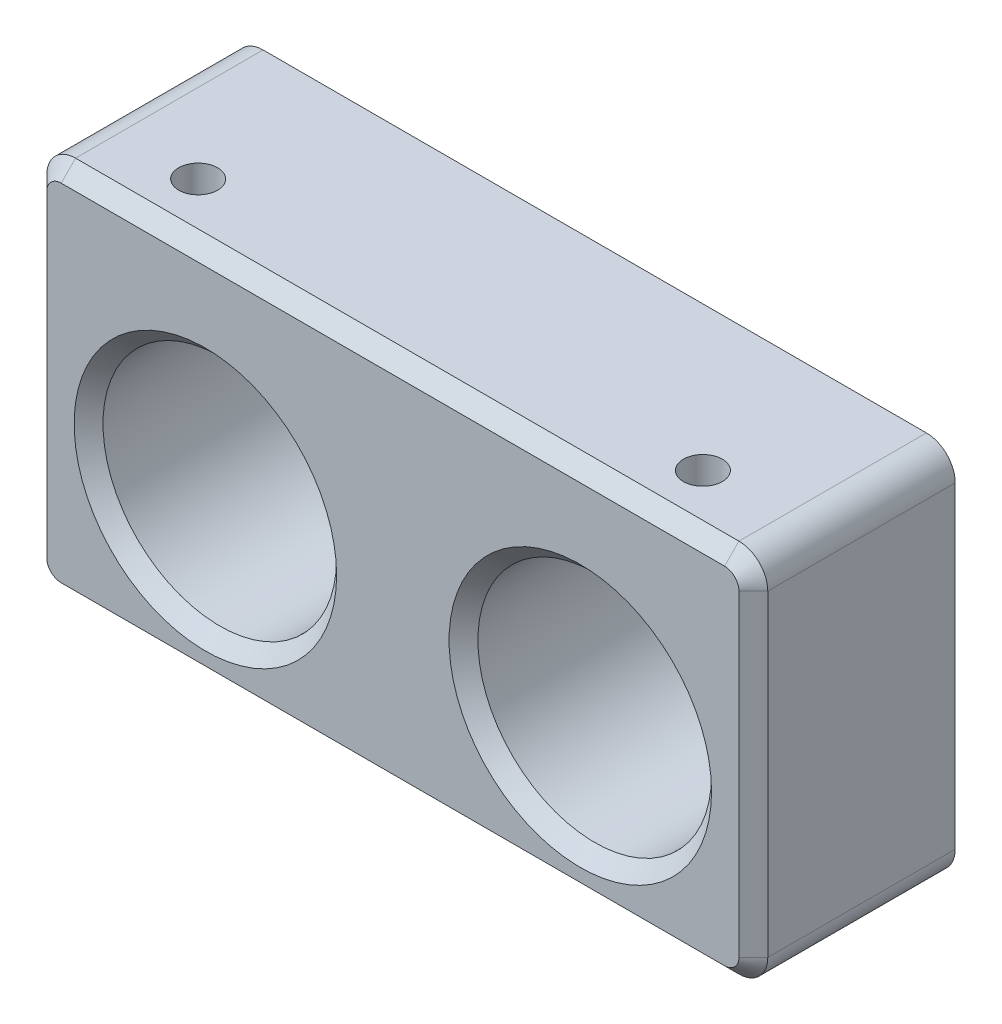
ISO-10303-21;
HEADER;
FILE_DESCRIPTION(('STEP AP214'),'2;1');
FILE_NAME('part.step','',(''),(''),'','','');
FILE_SCHEMA(('AUTOMOTIVE_DESIGN { 1 0 10303 214 1 1 1 1 }'));
ENDSEC;
DATA;
#1=APPLICATION_CONTEXT('core data for automotive mechanical design processes');
#2=APPLICATION_PROTOCOL_DEFINITION('international standard','automotive_design',2000,#1);
#3=PRODUCT_CONTEXT('',#1,'mechanical');
#4=PRODUCT('Part','Part','',(#3));
#5=PRODUCT_RELATED_PRODUCT_CATEGORY('part','',(#4));
#6=PRODUCT_DEFINITION_FORMATION('','',#4);
#7=PRODUCT_DEFINITION_CONTEXT('part definition',#1,'design');
#8=PRODUCT_DEFINITION('design','',#6,#7);
#9=PRODUCT_DEFINITION_SHAPE('','',#8);
#10=(LENGTH_UNIT() NAMED_UNIT(*) SI_UNIT(.MILLI.,.METRE.));
#11=(NAMED_UNIT(*) PLANE_ANGLE_UNIT() SI_UNIT($,.RADIAN.));
#12=(NAMED_UNIT(*) SI_UNIT($,.STERADIAN.) SOLID_ANGLE_UNIT());
#13=UNCERTAINTY_MEASURE_WITH_UNIT(LENGTH_MEASURE(1.E-05),#10,'distance_accuracy_value','');
#14=(GEOMETRIC_REPRESENTATION_CONTEXT(3) GLOBAL_UNCERTAINTY_ASSIGNED_CONTEXT((#13)) GLOBAL_UNIT_ASSIGNED_CONTEXT((#10,
#11,#12)) REPRESENTATION_CONTEXT('',''));
#15=CARTESIAN_POINT('',(0.,0.,0.));
#16=DIRECTION('',(0.,0.,1.));
#17=DIRECTION('',(1.,0.,0.));
#18=AXIS2_PLACEMENT_3D('',#15,#16,#17);
#19=CARTESIAN_POINT('',(0.,0.,14.));
#20=DIRECTION('',(0.,0.,1.));
#21=DIRECTION('',(1.,0.,0.));
#22=AXIS2_PLACEMENT_3D('',#19,#20,#21);
#23=PLANE('',#22);
#24=CARTESIAN_POINT('',(23.,13.,14.));
#25=DIRECTION('',(0.,0.,1.));
#26=DIRECTION('',(1.,0.,0.));
#27=AXIS2_PLACEMENT_3D('',#24,#25,#26);
#28=CIRCLE('',#27,1.);
#29=CARTESIAN_POINT('',(24.,13.,14.));
#30=VERTEX_POINT('',#29);
#31=CARTESIAN_POINT('',(23.,14.,14.));
#32=VERTEX_POINT('',#31);
#33=EDGE_CURVE('E329',#30,#32,#28,.T.);
#34=ORIENTED_EDGE('',*,*,#33,.T.);
#35=DIRECTION('',(-1.,0.,0.));
#36=VECTOR('',#35,1.);
#37=CARTESIAN_POINT('',(-23.,14.,14.));
#38=LINE('',#37,#36);
#39=CARTESIAN_POINT('',(-23.,14.,14.));
#40=VERTEX_POINT('',#39);
#41=EDGE_CURVE('E333',#32,#40,#38,.T.);
#42=ORIENTED_EDGE('',*,*,#41,.T.);
#43=CARTESIAN_POINT('',(-23.,13.,14.));
#44=DIRECTION('',(0.,0.,1.));
#45=DIRECTION('',(1.,0.,0.));
#46=AXIS2_PLACEMENT_3D('',#43,#44,#45);
#47=CIRCLE('',#46,1.);
#48=CARTESIAN_POINT('',(-24.,13.,14.));
#49=VERTEX_POINT('',#48);
#50=EDGE_CURVE('E331',#40,#49,#47,.T.);
#51=ORIENTED_EDGE('',*,*,#50,.T.);
#52=DIRECTION('',(0.,-1.,0.));
#53=VECTOR('',#52,1.);
#54=CARTESIAN_POINT('',(-24.,-8.99999999999999,14.));
#55=LINE('',#54,#53);
#56=CARTESIAN_POINT('',(-24.,-9.,14.));
#57=VERTEX_POINT('',#56);
#58=EDGE_CURVE('E327',#49,#57,#55,.T.);
#59=ORIENTED_EDGE('',*,*,#58,.T.);
#60=CARTESIAN_POINT('',(-23.,-9.,14.));
#61=DIRECTION('',(0.,0.,1.));
#62=DIRECTION('',(1.,0.,0.));
#63=AXIS2_PLACEMENT_3D('',#60,#61,#62);
#64=CIRCLE('',#63,0.999999999999997);
#65=CARTESIAN_POINT('',(-23.,-10.,14.));
#66=VERTEX_POINT('',#65);
#67=EDGE_CURVE('E323',#57,#66,#64,.T.);
#68=ORIENTED_EDGE('',*,*,#67,.T.);
#69=DIRECTION('',(1.,0.,0.));
#70=VECTOR('',#69,1.);
#71=CARTESIAN_POINT('',(23.,-10.,14.));
#72=LINE('',#71,#70);
#73=CARTESIAN_POINT('',(23.,-10.,14.));
#74=VERTEX_POINT('',#73);
#75=EDGE_CURVE('E319',#66,#74,#72,.T.);
#76=ORIENTED_EDGE('',*,*,#75,.T.);
#77=CARTESIAN_POINT('',(23.,-9.,14.));
#78=DIRECTION('',(0.,0.,1.));
#79=DIRECTION('',(1.,0.,0.));
#80=AXIS2_PLACEMENT_3D('',#77,#78,#79);
#81=CIRCLE('',#80,1.);
#82=CARTESIAN_POINT('',(24.,-9.,14.));
#83=VERTEX_POINT('',#82);
#84=EDGE_CURVE('E321',#74,#83,#81,.T.);
#85=ORIENTED_EDGE('',*,*,#84,.T.);
#86=DIRECTION('',(0.,1.,0.));
#87=VECTOR('',#86,1.);
#88=CARTESIAN_POINT('',(24.,13.,14.));
#89=LINE('',#88,#87);
#90=EDGE_CURVE('E325',#83,#30,#89,.T.);
#91=ORIENTED_EDGE('',*,*,#90,.T.);
#92=EDGE_LOOP('',(#34,#42,#51,#59,#68,#76,#85,#91));
#93=FACE_BOUND('',#92,.T.);
#94=CARTESIAN_POINT('',(13.,0.,14.));
#95=DIRECTION('',(0.,0.,1.));
#96=DIRECTION('',(1.,0.,0.));
#97=AXIS2_PLACEMENT_3D('',#94,#95,#96);
#98=CIRCLE('',#97,9.1);
#99=CARTESIAN_POINT('',(22.1,0.,14.));
#100=VERTEX_POINT('',#99);
#101=EDGE_CURVE('E286',#100,#100,#98,.F.);
#102=ORIENTED_EDGE('',*,*,#101,.T.);
#103=EDGE_LOOP('',(#102));
#104=FACE_BOUND('',#103,.T.);
#105=CARTESIAN_POINT('',(-13.,0.,14.));
#106=DIRECTION('',(0.,0.,1.));
#107=DIRECTION('',(1.,0.,0.));
#108=AXIS2_PLACEMENT_3D('',#105,#106,#107);
#109=CIRCLE('',#108,9.10000000000002);
#110=CARTESIAN_POINT('',(-3.89999999999998,0.,14.));
#111=VERTEX_POINT('',#110);
#112=EDGE_CURVE('E283',#111,#111,#109,.F.);
#113=ORIENTED_EDGE('',*,*,#112,.T.);
#114=EDGE_LOOP('',(#113));
#115=FACE_BOUND('',#114,.T.);
#116=ADVANCED_FACE('F35',(#93,#104,#115),#23,.T.);
#117=CARTESIAN_POINT('',(0.,0.,0.));
#118=DIRECTION('',(0.,0.,1.));
#119=DIRECTION('',(1.,0.,0.));
#120=AXIS2_PLACEMENT_3D('',#117,#118,#119);
#121=PLANE('',#120);
#122=DIRECTION('',(-1.,0.,0.));
#123=VECTOR('',#122,1.);
#124=CARTESIAN_POINT('',(6.,7.,0.));
#125=LINE('',#124,#123);
#126=CARTESIAN_POINT('',(6.,7.,0.));
#127=VERTEX_POINT('',#126);
#128=CARTESIAN_POINT('',(-6.,7.,0.));
#129=VERTEX_POINT('',#128);
#130=EDGE_CURVE('E234',#127,#129,#125,.T.);
#131=ORIENTED_EDGE('',*,*,#130,.F.);
#132=DIRECTION('',(0.,-1.,0.));
#133=VECTOR('',#132,1.);
#134=CARTESIAN_POINT('',(6.,11.,0.));
#135=LINE('',#134,#133);
#136=CARTESIAN_POINT('',(6.,11.,0.));
#137=VERTEX_POINT('',#136);
#138=EDGE_CURVE('E232',#137,#127,#135,.T.);
#139=ORIENTED_EDGE('',*,*,#138,.F.);
#140=DIRECTION('',(1.,0.,0.));
#141=VECTOR('',#140,1.);
#142=CARTESIAN_POINT('',(6.,11.,0.));
#143=LINE('',#142,#141);
#144=CARTESIAN_POINT('',(-6.,11.,0.));
#145=VERTEX_POINT('',#144);
#146=EDGE_CURVE('E222',#145,#137,#143,.T.);
#147=ORIENTED_EDGE('',*,*,#146,.F.);
#148=DIRECTION('',(0.,1.,0.));
#149=VECTOR('',#148,1.);
#150=CARTESIAN_POINT('',(-6.,11.,0.));
#151=LINE('',#150,#149);
#152=EDGE_CURVE('E238',#129,#145,#151,.T.);
#153=ORIENTED_EDGE('',*,*,#152,.F.);
#154=EDGE_LOOP('',(#131,#139,#147,#153));
#155=FACE_BOUND('',#154,.T.);
#156=DIRECTION('',(0.,-1.,0.));
#157=VECTOR('',#156,1.);
#158=CARTESIAN_POINT('',(-25.,15.,0.));
#159=LINE('',#158,#157);
#160=CARTESIAN_POINT('',(-25.,13.,0.));
#161=VERTEX_POINT('',#160);
#162=CARTESIAN_POINT('',(-25.,-8.99999999999999,0.));
#163=VERTEX_POINT('',#162);
#164=EDGE_CURVE('E269',#161,#163,#159,.T.);
#165=ORIENTED_EDGE('',*,*,#164,.F.);
#166=CARTESIAN_POINT('',(-23.,13.,0.));
#167=DIRECTION('',(0.,0.,1.));
#168=DIRECTION('',(1.,0.,0.));
#169=AXIS2_PLACEMENT_3D('',#166,#167,#168);
#170=CIRCLE('',#169,2.);
#171=CARTESIAN_POINT('',(-23.,15.,0.));
#172=VERTEX_POINT('',#171);
#173=EDGE_CURVE('E303',#161,#172,#170,.F.);
#174=ORIENTED_EDGE('',*,*,#173,.T.);
#175=DIRECTION('',(-1.,0.,0.));
#176=VECTOR('',#175,1.);
#177=CARTESIAN_POINT('',(-25.,15.,0.));
#178=LINE('',#177,#176);
#179=CARTESIAN_POINT('',(23.,15.,0.));
#180=VERTEX_POINT('',#179);
#181=EDGE_CURVE('E277',#180,#172,#178,.T.);
#182=ORIENTED_EDGE('',*,*,#181,.F.);
#183=CARTESIAN_POINT('',(23.,13.,0.));
#184=DIRECTION('',(0.,0.,1.));
#185=DIRECTION('',(1.,0.,0.));
#186=AXIS2_PLACEMENT_3D('',#183,#184,#185);
#187=CIRCLE('',#186,2.);
#188=CARTESIAN_POINT('',(25.,13.,0.));
#189=VERTEX_POINT('',#188);
#190=EDGE_CURVE('E301',#180,#189,#187,.F.);
#191=ORIENTED_EDGE('',*,*,#190,.T.);
#192=DIRECTION('',(0.,1.,0.));
#193=VECTOR('',#192,1.);
#194=CARTESIAN_POINT('',(25.,15.,0.));
#195=LINE('',#194,#193);
#196=CARTESIAN_POINT('',(25.,-8.99999999999999,0.));
#197=VERTEX_POINT('',#196);
#198=EDGE_CURVE('E274',#197,#189,#195,.T.);
#199=ORIENTED_EDGE('',*,*,#198,.F.);
#200=CARTESIAN_POINT('',(23.,-9.,0.));
#201=DIRECTION('',(0.,0.,1.));
#202=DIRECTION('',(1.,0.,0.));
#203=AXIS2_PLACEMENT_3D('',#200,#201,#202);
#204=CIRCLE('',#203,2.);
#205=CARTESIAN_POINT('',(23.,-11.,0.));
#206=VERTEX_POINT('',#205);
#207=EDGE_CURVE('E299',#197,#206,#204,.F.);
#208=ORIENTED_EDGE('',*,*,#207,.T.);
#209=DIRECTION('',(1.,0.,0.));
#210=VECTOR('',#209,1.);
#211=CARTESIAN_POINT('',(-25.,-11.,0.));
#212=LINE('',#211,#210);
#213=CARTESIAN_POINT('',(6.,-11.,0.));
#214=VERTEX_POINT('',#213);
#215=EDGE_CURVE('E272',#214,#206,#212,.T.);
#216=ORIENTED_EDGE('',*,*,#215,.F.);
#217=DIRECTION('',(0.,-1.,0.));
#218=VECTOR('',#217,1.);
#219=CARTESIAN_POINT('',(6.,-11.,0.));
#220=LINE('',#219,#218);
#221=CARTESIAN_POINT('',(6.,-7.00000000000001,0.));
#222=VERTEX_POINT('',#221);
#223=EDGE_CURVE('E372',#222,#214,#220,.T.);
#224=ORIENTED_EDGE('',*,*,#223,.F.);
#225=CARTESIAN_POINT('',(5.,-7.,0.));
#226=DIRECTION('',(0.,0.,-1.));
#227=DIRECTION('',(1.,0.,0.));
#228=AXIS2_PLACEMENT_3D('',#225,#226,#227);
#229=CIRCLE('',#228,1.);
#230=CARTESIAN_POINT('',(4.99999999999999,-6.,0.));
#231=VERTEX_POINT('',#230);
#232=EDGE_CURVE('E390',#231,#222,#229,.T.);
#233=ORIENTED_EDGE('',*,*,#232,.F.);
#234=DIRECTION('',(1.,0.,0.));
#235=VECTOR('',#234,1.);
#236=CARTESIAN_POINT('',(4.99999999999999,-6.,0.));
#237=LINE('',#236,#235);
#238=CARTESIAN_POINT('',(-4.99999999999999,-6.,0.));
#239=VERTEX_POINT('',#238);
#240=EDGE_CURVE('E387',#239,#231,#237,.T.);
#241=ORIENTED_EDGE('',*,*,#240,.F.);
#242=CARTESIAN_POINT('',(-5.,-7.,0.));
#243=DIRECTION('',(0.,0.,-1.));
#244=DIRECTION('',(1.,0.,0.));
#245=AXIS2_PLACEMENT_3D('',#242,#243,#244);
#246=CIRCLE('',#245,1.);
#247=CARTESIAN_POINT('',(-6.,-7.00000000000001,0.));
#248=VERTEX_POINT('',#247);
#249=EDGE_CURVE('E380',#248,#239,#246,.T.);
#250=ORIENTED_EDGE('',*,*,#249,.F.);
#251=DIRECTION('',(0.,1.,0.));
#252=VECTOR('',#251,1.);
#253=CARTESIAN_POINT('',(-6.,-11.,0.));
#254=LINE('',#253,#252);
#255=CARTESIAN_POINT('',(-6.,-11.,0.));
#256=VERTEX_POINT('',#255);
#257=EDGE_CURVE('E376',#256,#248,#254,.T.);
#258=ORIENTED_EDGE('',*,*,#257,.F.);
#259=CARTESIAN_POINT('',(-23.,-11.,0.));
#260=VERTEX_POINT('',#259);
#261=EDGE_CURVE('E209',#260,#256,#212,.T.);
#262=ORIENTED_EDGE('',*,*,#261,.F.);
#263=CARTESIAN_POINT('',(-23.,-9.,0.));
#264=DIRECTION('',(0.,0.,1.));
#265=DIRECTION('',(1.,0.,0.));
#266=AXIS2_PLACEMENT_3D('',#263,#264,#265);
#267=CIRCLE('',#266,2.);
#268=EDGE_CURVE('E297',#260,#163,#267,.F.);
#269=ORIENTED_EDGE('',*,*,#268,.T.);
#270=EDGE_LOOP('',(#165,#174,#182,#191,#199,#208,#216,#224,#233,#241,#250,#258,#262,#269));
#271=FACE_BOUND('',#270,.T.);
#272=CARTESIAN_POINT('',(-13.,0.,0.));
#273=DIRECTION('',(0.,0.,1.));
#274=DIRECTION('',(1.,0.,0.));
#275=AXIS2_PLACEMENT_3D('',#272,#273,#274);
#276=CIRCLE('',#275,8.1);
#277=CARTESIAN_POINT('',(-4.9,0.,0.));
#278=VERTEX_POINT('',#277);
#279=EDGE_CURVE('E266',#278,#278,#276,.T.);
#280=ORIENTED_EDGE('',*,*,#279,.T.);
#281=EDGE_LOOP('',(#280));
#282=FACE_BOUND('',#281,.T.);
#283=CARTESIAN_POINT('',(13.,0.,0.));
#284=DIRECTION('',(0.,0.,1.));
#285=DIRECTION('',(1.,0.,0.));
#286=AXIS2_PLACEMENT_3D('',#283,#284,#285);
#287=CIRCLE('',#286,8.1);
#288=CARTESIAN_POINT('',(21.1,0.,0.));
#289=VERTEX_POINT('',#288);
#290=EDGE_CURVE('E261',#289,#289,#287,.T.);
#291=ORIENTED_EDGE('',*,*,#290,.T.);
#292=EDGE_LOOP('',(#291));
#293=FACE_BOUND('',#292,.T.);
#294=ADVANCED_FACE('F407',(#155,#271,#282,#293),#121,.F.);
#295=CARTESIAN_POINT('',(-25.,15.,14.));
#296=DIRECTION('',(1.,0.,0.));
#297=DIRECTION('',(0.,1.,0.));
#298=AXIS2_PLACEMENT_3D('',#295,#296,#297);
#299=PLANE('',#298);
#300=DIRECTION('',(0.,0.,-1.));
#301=VECTOR('',#300,1.);
#302=CARTESIAN_POINT('',(-25.,-9.,14.));
#303=LINE('',#302,#301);
#304=CARTESIAN_POINT('',(-25.,-9.,13.));
#305=VERTEX_POINT('',#304);
#306=EDGE_CURVE('E292',#163,#305,#303,.F.);
#307=ORIENTED_EDGE('',*,*,#306,.T.);
#308=DIRECTION('',(0.,1.,0.));
#309=VECTOR('',#308,1.);
#310=CARTESIAN_POINT('',(-25.,13.,13.));
#311=LINE('',#310,#309);
#312=CARTESIAN_POINT('',(-25.,13.,13.));
#313=VERTEX_POINT('',#312);
#314=EDGE_CURVE('E343',#305,#313,#311,.T.);
#315=ORIENTED_EDGE('',*,*,#314,.T.);
#316=DIRECTION('',(0.,0.,-1.));
#317=VECTOR('',#316,1.);
#318=CARTESIAN_POINT('',(-25.,13.,14.));
#319=LINE('',#318,#317);
#320=EDGE_CURVE('E295',#313,#161,#319,.T.);
#321=ORIENTED_EDGE('',*,*,#320,.T.);
#322=ORIENTED_EDGE('',*,*,#164,.T.);
#323=EDGE_LOOP('',(#307,#315,#321,#322));
#324=FACE_BOUND('',#323,.T.);
#325=ADVANCED_FACE('F430',(#324),#299,.F.);
#326=CARTESIAN_POINT('',(-25.,-11.,14.));
#327=DIRECTION('',(0.,1.,0.));
#328=DIRECTION('',(0.,0.,1.));
#329=AXIS2_PLACEMENT_3D('',#326,#327,#328);
#330=PLANE('',#329);
#331=DIRECTION('',(0.,0.,-1.));
#332=VECTOR('',#331,1.);
#333=CARTESIAN_POINT('',(23.,-11.,14.));
#334=LINE('',#333,#332);
#335=CARTESIAN_POINT('',(23.,-11.,13.));
#336=VERTEX_POINT('',#335);
#337=EDGE_CURVE('E317',#206,#336,#334,.F.);
#338=ORIENTED_EDGE('',*,*,#337,.T.);
#339=DIRECTION('',(-1.,0.,0.));
#340=VECTOR('',#339,1.);
#341=CARTESIAN_POINT('',(-23.,-11.,13.));
#342=LINE('',#341,#340);
#343=CARTESIAN_POINT('',(-23.,-11.,13.));
#344=VERTEX_POINT('',#343);
#345=EDGE_CURVE('E11',#336,#344,#342,.T.);
#346=ORIENTED_EDGE('',*,*,#345,.T.);
#347=DIRECTION('',(0.,0.,-1.));
#348=VECTOR('',#347,1.);
#349=CARTESIAN_POINT('',(-23.,-11.,14.));
#350=LINE('',#349,#348);
#351=EDGE_CURVE('E315',#344,#260,#350,.T.);
#352=ORIENTED_EDGE('',*,*,#351,.T.);
#353=ORIENTED_EDGE('',*,*,#261,.T.);
#354=DIRECTION('',(0.,0.,-1.));
#355=VECTOR('',#354,1.);
#356=CARTESIAN_POINT('',(-6.,-11.,4.));
#357=LINE('',#356,#355);
#358=CARTESIAN_POINT('',(-6.,-11.,4.));
#359=VERTEX_POINT('',#358);
#360=EDGE_CURVE('E190',#359,#256,#357,.T.);
#361=ORIENTED_EDGE('',*,*,#360,.F.);
#362=DIRECTION('',(-1.,0.,0.));
#363=VECTOR('',#362,1.);
#364=CARTESIAN_POINT('',(6.,-11.,4.));
#365=LINE('',#364,#363);
#366=CARTESIAN_POINT('',(6.,-11.,4.));
#367=VERTEX_POINT('',#366);
#368=EDGE_CURVE('E197',#367,#359,#365,.T.);
#369=ORIENTED_EDGE('',*,*,#368,.F.);
#370=DIRECTION('',(0.,0.,-1.));
#371=VECTOR('',#370,1.);
#372=CARTESIAN_POINT('',(6.,-11.,4.));
#373=LINE('',#372,#371);
#374=EDGE_CURVE('E210',#367,#214,#373,.T.);
#375=ORIENTED_EDGE('',*,*,#374,.T.);
#376=ORIENTED_EDGE('',*,*,#215,.T.);
#377=EDGE_LOOP('',(#338,#346,#352,#353,#361,#369,#375,#376));
#378=FACE_BOUND('',#377,.T.);
#379=ADVANCED_FACE('F207',(#378),#330,.F.);
#380=CARTESIAN_POINT('',(25.,15.,14.));
#381=DIRECTION('',(-1.,0.,0.));
#382=DIRECTION('',(0.,-1.,0.));
#383=AXIS2_PLACEMENT_3D('',#380,#381,#382);
#384=PLANE('',#383);
#385=DIRECTION('',(0.,0.,-1.));
#386=VECTOR('',#385,1.);
#387=CARTESIAN_POINT('',(25.,13.,14.));
#388=LINE('',#387,#386);
#389=CARTESIAN_POINT('',(25.,13.,13.));
#390=VERTEX_POINT('',#389);
#391=EDGE_CURVE('E312',#189,#390,#388,.F.);
#392=ORIENTED_EDGE('',*,*,#391,.T.);
#393=DIRECTION('',(0.,-1.,0.));
#394=VECTOR('',#393,1.);
#395=CARTESIAN_POINT('',(25.,-8.99999999999999,13.));
#396=LINE('',#395,#394);
#397=CARTESIAN_POINT('',(25.,-9.,13.));
#398=VERTEX_POINT('',#397);
#399=EDGE_CURVE('E345',#390,#398,#396,.T.);
#400=ORIENTED_EDGE('',*,*,#399,.T.);
#401=DIRECTION('',(0.,0.,-1.));
#402=VECTOR('',#401,1.);
#403=CARTESIAN_POINT('',(25.,-9.,14.));
#404=LINE('',#403,#402);
#405=EDGE_CURVE('E310',#398,#197,#404,.T.);
#406=ORIENTED_EDGE('',*,*,#405,.T.);
#407=ORIENTED_EDGE('',*,*,#198,.T.);
#408=EDGE_LOOP('',(#392,#400,#406,#407));
#409=FACE_BOUND('',#408,.T.);
#410=ADVANCED_FACE('F457',(#409),#384,.F.);
#411=CARTESIAN_POINT('',(-25.,15.,14.));
#412=DIRECTION('',(0.,-1.,0.));
#413=DIRECTION('',(0.,0.,-1.));
#414=AXIS2_PLACEMENT_3D('',#411,#412,#413);
#415=PLANE('',#414);
#416=CARTESIAN_POINT('',(17.5,15.,10.));
#417=DIRECTION('',(0.,1.,0.));
#418=DIRECTION('',(0.,0.,1.));
#419=AXIS2_PLACEMENT_3D('',#416,#417,#418);
#420=CIRCLE('',#419,1.35);
#421=CARTESIAN_POINT('',(17.5,15.,11.35));
#422=VERTEX_POINT('',#421);
#423=EDGE_CURVE('E245',#422,#422,#420,.T.);
#424=ORIENTED_EDGE('',*,*,#423,.F.);
#425=EDGE_LOOP('',(#424));
#426=FACE_BOUND('',#425,.T.);
#427=CARTESIAN_POINT('',(-17.5,15.,10.));
#428=DIRECTION('',(0.,1.,0.));
#429=DIRECTION('',(0.,0.,1.));
#430=AXIS2_PLACEMENT_3D('',#427,#428,#429);
#431=CIRCLE('',#430,1.35);
#432=CARTESIAN_POINT('',(-17.5,15.,11.35));
#433=VERTEX_POINT('',#432);
#434=EDGE_CURVE('E255',#433,#433,#431,.T.);
#435=ORIENTED_EDGE('',*,*,#434,.F.);
#436=EDGE_LOOP('',(#435));
#437=FACE_BOUND('',#436,.T.);
#438=DIRECTION('',(0.,0.,-1.));
#439=VECTOR('',#438,1.);
#440=CARTESIAN_POINT('',(-23.,15.,14.));
#441=LINE('',#440,#439);
#442=CARTESIAN_POINT('',(-23.,15.,13.));
#443=VERTEX_POINT('',#442);
#444=EDGE_CURVE('E307',#172,#443,#441,.F.);
#445=ORIENTED_EDGE('',*,*,#444,.T.);
#446=DIRECTION('',(1.,0.,0.));
#447=VECTOR('',#446,1.);
#448=CARTESIAN_POINT('',(23.,15.,13.));
#449=LINE('',#448,#447);
#450=CARTESIAN_POINT('',(23.,15.,13.));
#451=VERTEX_POINT('',#450);
#452=EDGE_CURVE('E336',#443,#451,#449,.T.);
#453=ORIENTED_EDGE('',*,*,#452,.T.);
#454=DIRECTION('',(0.,0.,-1.));
#455=VECTOR('',#454,1.);
#456=CARTESIAN_POINT('',(23.,15.,14.));
#457=LINE('',#456,#455);
#458=EDGE_CURVE('E305',#451,#180,#457,.T.);
#459=ORIENTED_EDGE('',*,*,#458,.T.);
#460=ORIENTED_EDGE('',*,*,#181,.T.);
#461=EDGE_LOOP('',(#445,#453,#459,#460));
#462=FACE_BOUND('',#461,.T.);
#463=ADVANCED_FACE('F437',(#426,#437,#462),#415,.F.);
#464=CARTESIAN_POINT('',(-13.,0.,14.));
#465=DIRECTION('',(0.,0.,-1.));
#466=DIRECTION('',(-1.,0.,0.));
#467=AXIS2_PLACEMENT_3D('',#464,#465,#466);
#468=CYLINDRICAL_SURFACE('',#467,8.1);
#469=CARTESIAN_POINT('',(-13.,0.,13.));
#470=DIRECTION('',(0.,0.,1.));
#471=DIRECTION('',(1.,0.,0.));
#472=AXIS2_PLACEMENT_3D('',#469,#470,#471);
#473=CIRCLE('',#472,8.1);
#474=CARTESIAN_POINT('',(-4.9,0.,13.));
#475=VERTEX_POINT('',#474);
#476=EDGE_CURVE('E289',#475,#475,#473,.T.);
#477=ORIENTED_EDGE('',*,*,#476,.T.);
#478=EDGE_LOOP('',(#477));
#479=FACE_BOUND('',#478,.T.);
#480=ORIENTED_EDGE('',*,*,#279,.F.);
#481=EDGE_LOOP('',(#480));
#482=FACE_BOUND('',#481,.T.);
#483=ADVANCED_FACE('F485',(#479,#482),#468,.F.);
#484=CARTESIAN_POINT('',(13.,0.,14.));
#485=DIRECTION('',(0.,0.,-1.));
#486=DIRECTION('',(-1.,0.,0.));
#487=AXIS2_PLACEMENT_3D('',#484,#485,#486);
#488=CYLINDRICAL_SURFACE('',#487,8.1);
#489=CARTESIAN_POINT('',(13.,0.,13.));
#490=DIRECTION('',(0.,0.,1.));
#491=DIRECTION('',(1.,0.,0.));
#492=AXIS2_PLACEMENT_3D('',#489,#490,#491);
#493=CIRCLE('',#492,8.1);
#494=CARTESIAN_POINT('',(21.1,0.,13.));
#495=VERTEX_POINT('',#494);
#496=EDGE_CURVE('E280',#495,#495,#493,.T.);
#497=ORIENTED_EDGE('',*,*,#496,.T.);
#498=EDGE_LOOP('',(#497));
#499=FACE_BOUND('',#498,.T.);
#500=ORIENTED_EDGE('',*,*,#290,.F.);
#501=EDGE_LOOP('',(#500));
#502=FACE_BOUND('',#501,.T.);
#503=ADVANCED_FACE('F721',(#499,#502),#488,.F.);
#504=CARTESIAN_POINT('',(-17.5,10.,10.));
#505=DIRECTION('',(0.,1.,0.));
#506=DIRECTION('',(0.,0.,1.));
#507=AXIS2_PLACEMENT_3D('',#504,#505,#506);
#508=CYLINDRICAL_SURFACE('',#507,1.35);
#509=CARTESIAN_POINT('',(-17.5,10.,10.));
#510=DIRECTION('',(0.,1.,0.));
#511=DIRECTION('',(0.,0.,1.));
#512=AXIS2_PLACEMENT_3D('',#509,#510,#511);
#513=CIRCLE('',#512,1.35);
#514=CARTESIAN_POINT('',(-17.5,10.,11.35));
#515=VERTEX_POINT('',#514);
#516=EDGE_CURVE('E258',#515,#515,#513,.T.);
#517=ORIENTED_EDGE('',*,*,#516,.F.);
#518=EDGE_LOOP('',(#517));
#519=FACE_BOUND('',#518,.T.);
#520=ORIENTED_EDGE('',*,*,#434,.T.);
#521=EDGE_LOOP('',(#520));
#522=FACE_BOUND('',#521,.T.);
#523=ADVANCED_FACE('F712',(#519,#522),#508,.F.);
#524=CARTESIAN_POINT('',(-17.5,10.,10.));
#525=DIRECTION('',(0.,1.,0.));
#526=DIRECTION('',(0.,0.,1.));
#527=AXIS2_PLACEMENT_3D('',#524,#525,#526);
#528=PLANE('',#527);
#529=ORIENTED_EDGE('',*,*,#516,.T.);
#530=EDGE_LOOP('',(#529));
#531=FACE_BOUND('',#530,.T.);
#532=ADVANCED_FACE('F703',(#531),#528,.T.);
#533=CARTESIAN_POINT('',(17.5,10.,10.));
#534=DIRECTION('',(0.,1.,0.));
#535=DIRECTION('',(0.,0.,1.));
#536=AXIS2_PLACEMENT_3D('',#533,#534,#535);
#537=CYLINDRICAL_SURFACE('',#536,1.35);
#538=CARTESIAN_POINT('',(17.5,10.,10.));
#539=DIRECTION('',(0.,1.,0.));
#540=DIRECTION('',(0.,0.,1.));
#541=AXIS2_PLACEMENT_3D('',#538,#539,#540);
#542=CIRCLE('',#541,1.35);
#543=CARTESIAN_POINT('',(17.5,10.,11.35));
#544=VERTEX_POINT('',#543);
#545=EDGE_CURVE('E252',#544,#544,#542,.T.);
#546=ORIENTED_EDGE('',*,*,#545,.F.);
#547=EDGE_LOOP('',(#546));
#548=FACE_BOUND('',#547,.T.);
#549=ORIENTED_EDGE('',*,*,#423,.T.);
#550=EDGE_LOOP('',(#549));
#551=FACE_BOUND('',#550,.T.);
#552=ADVANCED_FACE('F694',(#548,#551),#537,.F.);
#553=CARTESIAN_POINT('',(17.5,10.,10.));
#554=DIRECTION('',(0.,1.,0.));
#555=DIRECTION('',(0.,0.,1.));
#556=AXIS2_PLACEMENT_3D('',#553,#554,#555);
#557=PLANE('',#556);
#558=ORIENTED_EDGE('',*,*,#545,.T.);
#559=EDGE_LOOP('',(#558));
#560=FACE_BOUND('',#559,.T.);
#561=ADVANCED_FACE('F685',(#560),#557,.T.);
#562=CARTESIAN_POINT('',(6.,11.,4.));
#563=DIRECTION('',(1.,0.,0.));
#564=DIRECTION('',(0.,0.,-1.));
#565=AXIS2_PLACEMENT_3D('',#562,#563,#564);
#566=PLANE('',#565);
#567=ORIENTED_EDGE('',*,*,#138,.T.);
#568=DIRECTION('',(0.,0.,-1.));
#569=VECTOR('',#568,1.);
#570=CARTESIAN_POINT('',(6.,7.,4.));
#571=LINE('',#570,#569);
#572=CARTESIAN_POINT('',(6.,7.,4.));
#573=VERTEX_POINT('',#572);
#574=EDGE_CURVE('E231',#573,#127,#571,.T.);
#575=ORIENTED_EDGE('',*,*,#574,.F.);
#576=DIRECTION('',(0.,-1.,0.));
#577=VECTOR('',#576,1.);
#578=CARTESIAN_POINT('',(6.,11.,4.));
#579=LINE('',#578,#577);
#580=CARTESIAN_POINT('',(6.,11.,4.));
#581=VERTEX_POINT('',#580);
#582=EDGE_CURVE('E218',#581,#573,#579,.T.);
#583=ORIENTED_EDGE('',*,*,#582,.F.);
#584=DIRECTION('',(0.,0.,-1.));
#585=VECTOR('',#584,1.);
#586=CARTESIAN_POINT('',(6.,11.,4.));
#587=LINE('',#586,#585);
#588=EDGE_CURVE('E243',#581,#137,#587,.T.);
#589=ORIENTED_EDGE('',*,*,#588,.T.);
#590=EDGE_LOOP('',(#567,#575,#583,#589));
#591=FACE_BOUND('',#590,.T.);
#592=ADVANCED_FACE('F676',(#591),#566,.F.);
#593=CARTESIAN_POINT('',(6.,11.,4.));
#594=DIRECTION('',(0.,1.,0.));
#595=DIRECTION('',(0.,0.,1.));
#596=AXIS2_PLACEMENT_3D('',#593,#594,#595);
#597=PLANE('',#596);
#598=ORIENTED_EDGE('',*,*,#146,.T.);
#599=ORIENTED_EDGE('',*,*,#588,.F.);
#600=DIRECTION('',(1.,0.,0.));
#601=VECTOR('',#600,1.);
#602=CARTESIAN_POINT('',(6.,11.,4.));
#603=LINE('',#602,#601);
#604=CARTESIAN_POINT('',(-6.,11.,4.));
#605=VERTEX_POINT('',#604);
#606=EDGE_CURVE('E228',#605,#581,#603,.T.);
#607=ORIENTED_EDGE('',*,*,#606,.F.);
#608=DIRECTION('',(0.,0.,-1.));
#609=VECTOR('',#608,1.);
#610=CARTESIAN_POINT('',(-6.,11.,4.));
#611=LINE('',#610,#609);
#612=EDGE_CURVE('E246',#605,#145,#611,.T.);
#613=ORIENTED_EDGE('',*,*,#612,.T.);
#614=EDGE_LOOP('',(#598,#599,#607,#613));
#615=FACE_BOUND('',#614,.T.);
#616=ADVANCED_FACE('F667',(#615),#597,.F.);
#617=CARTESIAN_POINT('',(-6.,11.,4.));
#618=DIRECTION('',(-1.,0.,0.));
#619=DIRECTION('',(0.,0.,1.));
#620=AXIS2_PLACEMENT_3D('',#617,#618,#619);
#621=PLANE('',#620);
#622=ORIENTED_EDGE('',*,*,#152,.T.);
#623=ORIENTED_EDGE('',*,*,#612,.F.);
#624=DIRECTION('',(0.,1.,0.));
#625=VECTOR('',#624,1.);
#626=CARTESIAN_POINT('',(-6.,11.,4.));
#627=LINE('',#626,#625);
#628=CARTESIAN_POINT('',(-6.,7.,4.));
#629=VERTEX_POINT('',#628);
#630=EDGE_CURVE('E225',#629,#605,#627,.T.);
#631=ORIENTED_EDGE('',*,*,#630,.F.);
#632=DIRECTION('',(0.,0.,-1.));
#633=VECTOR('',#632,1.);
#634=CARTESIAN_POINT('',(-6.,7.,4.));
#635=LINE('',#634,#633);
#636=EDGE_CURVE('E248',#629,#129,#635,.T.);
#637=ORIENTED_EDGE('',*,*,#636,.T.);
#638=EDGE_LOOP('',(#622,#623,#631,#637));
#639=FACE_BOUND('',#638,.T.);
#640=ADVANCED_FACE('F658',(#639),#621,.F.);
#641=CARTESIAN_POINT('',(6.,7.,4.));
#642=DIRECTION('',(0.,-1.,0.));
#643=DIRECTION('',(0.,0.,-1.));
#644=AXIS2_PLACEMENT_3D('',#641,#642,#643);
#645=PLANE('',#644);
#646=ORIENTED_EDGE('',*,*,#130,.T.);
#647=ORIENTED_EDGE('',*,*,#636,.F.);
#648=DIRECTION('',(-1.,0.,0.));
#649=VECTOR('',#648,1.);
#650=CARTESIAN_POINT('',(6.,7.,4.));
#651=LINE('',#650,#649);
#652=EDGE_CURVE('E221',#573,#629,#651,.T.);
#653=ORIENTED_EDGE('',*,*,#652,.F.);
#654=ORIENTED_EDGE('',*,*,#574,.T.);
#655=EDGE_LOOP('',(#646,#647,#653,#654));
#656=FACE_BOUND('',#655,.T.);
#657=ADVANCED_FACE('F649',(#656),#645,.F.);
#658=CARTESIAN_POINT('',(0.,0.,4.));
#659=DIRECTION('',(0.,0.,-1.));
#660=DIRECTION('',(-1.,0.,0.));
#661=AXIS2_PLACEMENT_3D('',#658,#659,#660);
#662=PLANE('',#661);
#663=ORIENTED_EDGE('',*,*,#582,.T.);
#664=ORIENTED_EDGE('',*,*,#652,.T.);
#665=ORIENTED_EDGE('',*,*,#630,.T.);
#666=ORIENTED_EDGE('',*,*,#606,.T.);
#667=EDGE_LOOP('',(#663,#664,#665,#666));
#668=FACE_BOUND('',#667,.T.);
#669=ADVANCED_FACE('F641',(#668),#662,.T.);
#670=CARTESIAN_POINT('',(6.,-11.,4.));
#671=DIRECTION('',(1.,0.,0.));
#672=DIRECTION('',(0.,1.,0.));
#673=AXIS2_PLACEMENT_3D('',#670,#671,#672);
#674=PLANE('',#673);
#675=ORIENTED_EDGE('',*,*,#223,.T.);
#676=ORIENTED_EDGE('',*,*,#374,.F.);
#677=DIRECTION('',(0.,-1.,0.));
#678=VECTOR('',#677,1.);
#679=CARTESIAN_POINT('',(6.,-11.,4.));
#680=LINE('',#679,#678);
#681=CARTESIAN_POINT('',(6.,-7.00000000000001,4.));
#682=VERTEX_POINT('',#681);
#683=EDGE_CURVE('E203',#682,#367,#680,.T.);
#684=ORIENTED_EDGE('',*,*,#683,.F.);
#685=DIRECTION('',(0.,0.,-1.));
#686=VECTOR('',#685,1.);
#687=CARTESIAN_POINT('',(6.,-7.00000000000001,4.));
#688=LINE('',#687,#686);
#689=EDGE_CURVE('E235',#682,#222,#688,.T.);
#690=ORIENTED_EDGE('',*,*,#689,.T.);
#691=EDGE_LOOP('',(#675,#676,#684,#690));
#692=FACE_BOUND('',#691,.T.);
#693=ADVANCED_FACE('F415',(#692),#674,.F.);
#694=CARTESIAN_POINT('',(5.,-7.,4.));
#695=DIRECTION('',(0.,0.,-1.));
#696=DIRECTION('',(-1.,0.,0.));
#697=AXIS2_PLACEMENT_3D('',#694,#695,#696);
#698=CYLINDRICAL_SURFACE('',#697,1.);
#699=ORIENTED_EDGE('',*,*,#232,.T.);
#700=ORIENTED_EDGE('',*,*,#689,.F.);
#701=CARTESIAN_POINT('',(5.,-7.,4.));
#702=DIRECTION('',(0.,0.,-1.));
#703=DIRECTION('',(1.,0.,0.));
#704=AXIS2_PLACEMENT_3D('',#701,#702,#703);
#705=CIRCLE('',#704,1.);
#706=CARTESIAN_POINT('',(4.99999999999999,-6.,4.));
#707=VERTEX_POINT('',#706);
#708=EDGE_CURVE('E214',#707,#682,#705,.T.);
#709=ORIENTED_EDGE('',*,*,#708,.F.);
#710=DIRECTION('',(0.,0.,-1.));
#711=VECTOR('',#710,1.);
#712=CARTESIAN_POINT('',(4.99999999999999,-6.,4.));
#713=LINE('',#712,#711);
#714=EDGE_CURVE('E394',#707,#231,#713,.T.);
#715=ORIENTED_EDGE('',*,*,#714,.T.);
#716=EDGE_LOOP('',(#699,#700,#709,#715));
#717=FACE_BOUND('',#716,.T.);
#718=ADVANCED_FACE('F411',(#717),#698,.F.);
#719=CARTESIAN_POINT('',(4.99999999999999,-6.,4.));
#720=DIRECTION('',(0.,1.,0.));
#721=DIRECTION('',(0.,0.,1.));
#722=AXIS2_PLACEMENT_3D('',#719,#720,#721);
#723=PLANE('',#722);
#724=ORIENTED_EDGE('',*,*,#240,.T.);
#725=ORIENTED_EDGE('',*,*,#714,.F.);
#726=DIRECTION('',(1.,0.,0.));
#727=VECTOR('',#726,1.);
#728=CARTESIAN_POINT('',(4.99999999999999,-6.,4.));
#729=LINE('',#728,#727);
#730=CARTESIAN_POINT('',(-4.99999999999999,-6.,4.));
#731=VERTEX_POINT('',#730);
#732=EDGE_CURVE('E401',#731,#707,#729,.T.);
#733=ORIENTED_EDGE('',*,*,#732,.F.);
#734=DIRECTION('',(0.,0.,-1.));
#735=VECTOR('',#734,1.);
#736=CARTESIAN_POINT('',(-4.99999999999999,-6.,4.));
#737=LINE('',#736,#735);
#738=EDGE_CURVE('E212',#731,#239,#737,.T.);
#739=ORIENTED_EDGE('',*,*,#738,.T.);
#740=EDGE_LOOP('',(#724,#725,#733,#739));
#741=FACE_BOUND('',#740,.T.);
#742=ADVANCED_FACE('F397',(#741),#723,.F.);
#743=CARTESIAN_POINT('',(-5.,-7.,4.));
#744=DIRECTION('',(0.,0.,-1.));
#745=DIRECTION('',(-1.,0.,0.));
#746=AXIS2_PLACEMENT_3D('',#743,#744,#745);
#747=CYLINDRICAL_SURFACE('',#746,1.);
#748=ORIENTED_EDGE('',*,*,#249,.T.);
#749=ORIENTED_EDGE('',*,*,#738,.F.);
#750=CARTESIAN_POINT('',(-5.,-7.,4.));
#751=DIRECTION('',(0.,0.,-1.));
#752=DIRECTION('',(1.,0.,0.));
#753=AXIS2_PLACEMENT_3D('',#750,#751,#752);
#754=CIRCLE('',#753,1.);
#755=CARTESIAN_POINT('',(-6.,-7.00000000000001,4.));
#756=VERTEX_POINT('',#755);
#757=EDGE_CURVE('E196',#756,#731,#754,.T.);
#758=ORIENTED_EDGE('',*,*,#757,.F.);
#759=DIRECTION('',(0.,0.,-1.));
#760=VECTOR('',#759,1.);
#761=CARTESIAN_POINT('',(-6.,-7.00000000000001,4.));
#762=LINE('',#761,#760);
#763=EDGE_CURVE('E192',#756,#248,#762,.T.);
#764=ORIENTED_EDGE('',*,*,#763,.T.);
#765=EDGE_LOOP('',(#748,#749,#758,#764));
#766=FACE_BOUND('',#765,.T.);
#767=ADVANCED_FACE('F404',(#766),#747,.F.);
#768=CARTESIAN_POINT('',(-6.,-11.,4.));
#769=DIRECTION('',(-1.,0.,0.));
#770=DIRECTION('',(0.,-1.,0.));
#771=AXIS2_PLACEMENT_3D('',#768,#769,#770);
#772=PLANE('',#771);
#773=ORIENTED_EDGE('',*,*,#257,.T.);
#774=ORIENTED_EDGE('',*,*,#763,.F.);
#775=DIRECTION('',(0.,1.,0.));
#776=VECTOR('',#775,1.);
#777=CARTESIAN_POINT('',(-6.,-11.,4.));
#778=LINE('',#777,#776);
#779=EDGE_CURVE('E185',#359,#756,#778,.T.);
#780=ORIENTED_EDGE('',*,*,#779,.F.);
#781=ORIENTED_EDGE('',*,*,#360,.T.);
#782=EDGE_LOOP('',(#773,#774,#780,#781));
#783=FACE_BOUND('',#782,.T.);
#784=ADVANCED_FACE('F188',(#783),#772,.F.);
#785=CARTESIAN_POINT('',(5.,-7.,4.));
#786=DIRECTION('',(0.,0.,1.));
#787=DIRECTION('',(1.,0.,0.));
#788=AXIS2_PLACEMENT_3D('',#785,#786,#787);
#789=PLANE('',#788);
#790=ORIENTED_EDGE('',*,*,#683,.T.);
#791=ORIENTED_EDGE('',*,*,#368,.T.);
#792=ORIENTED_EDGE('',*,*,#779,.T.);
#793=ORIENTED_EDGE('',*,*,#757,.T.);
#794=ORIENTED_EDGE('',*,*,#732,.T.);
#795=ORIENTED_EDGE('',*,*,#708,.T.);
#796=EDGE_LOOP('',(#790,#791,#792,#793,#794,#795));
#797=FACE_BOUND('',#796,.T.);
#798=ADVANCED_FACE('F200',(#797),#789,.F.);
#799=CARTESIAN_POINT('',(13.,0.,13.));
#800=DIRECTION('',(0.,0.,1.));
#801=DIRECTION('',(1.,0.,0.));
#802=AXIS2_PLACEMENT_3D('',#799,#800,#801);
#803=CONICAL_SURFACE('',#802,8.1,0.785398163397452);
#804=ORIENTED_EDGE('',*,*,#101,.F.);
#805=EDGE_LOOP('',(#804));
#806=FACE_BOUND('',#805,.T.);
#807=ORIENTED_EDGE('',*,*,#496,.F.);
#808=EDGE_LOOP('',(#807));
#809=FACE_BOUND('',#808,.T.);
#810=ADVANCED_FACE('F496',(#806,#809),#803,.F.);
#811=CARTESIAN_POINT('',(-13.,0.,13.));
#812=DIRECTION('',(0.,0.,1.));
#813=DIRECTION('',(1.,0.,0.));
#814=AXIS2_PLACEMENT_3D('',#811,#812,#813);
#815=CONICAL_SURFACE('',#814,8.1,0.785398163397451);
#816=ORIENTED_EDGE('',*,*,#112,.F.);
#817=EDGE_LOOP('',(#816));
#818=FACE_BOUND('',#817,.T.);
#819=ORIENTED_EDGE('',*,*,#476,.F.);
#820=EDGE_LOOP('',(#819));
#821=FACE_BOUND('',#820,.T.);
#822=ADVANCED_FACE('F499',(#818,#821),#815,.F.);
#823=CARTESIAN_POINT('',(-23.,13.,14.));
#824=DIRECTION('',(0.,0.,-1.));
#825=DIRECTION('',(-1.,0.,0.));
#826=AXIS2_PLACEMENT_3D('',#823,#824,#825);
#827=CYLINDRICAL_SURFACE('',#826,2.);
#828=ORIENTED_EDGE('',*,*,#320,.F.);
#829=CARTESIAN_POINT('',(-23.,13.,13.));
#830=DIRECTION('',(0.,0.,1.));
#831=DIRECTION('',(1.,0.,0.));
#832=AXIS2_PLACEMENT_3D('',#829,#830,#831);
#833=CIRCLE('',#832,2.);
#834=EDGE_CURVE('E339',#313,#443,#833,.F.);
#835=ORIENTED_EDGE('',*,*,#834,.T.);
#836=ORIENTED_EDGE('',*,*,#444,.F.);
#837=ORIENTED_EDGE('',*,*,#173,.F.);
#838=EDGE_LOOP('',(#828,#835,#836,#837));
#839=FACE_BOUND('',#838,.T.);
#840=ADVANCED_FACE('F441',(#839),#827,.T.);
#841=CARTESIAN_POINT('',(23.,13.,14.));
#842=DIRECTION('',(0.,0.,-1.));
#843=DIRECTION('',(-1.,0.,0.));
#844=AXIS2_PLACEMENT_3D('',#841,#842,#843);
#845=CYLINDRICAL_SURFACE('',#844,2.);
#846=ORIENTED_EDGE('',*,*,#458,.F.);
#847=CARTESIAN_POINT('',(23.,13.,13.));
#848=DIRECTION('',(0.,0.,1.));
#849=DIRECTION('',(1.,0.,0.));
#850=AXIS2_PLACEMENT_3D('',#847,#848,#849);
#851=CIRCLE('',#850,2.);
#852=EDGE_CURVE('E341',#451,#390,#851,.F.);
#853=ORIENTED_EDGE('',*,*,#852,.T.);
#854=ORIENTED_EDGE('',*,*,#391,.F.);
#855=ORIENTED_EDGE('',*,*,#190,.F.);
#856=EDGE_LOOP('',(#846,#853,#854,#855));
#857=FACE_BOUND('',#856,.T.);
#858=ADVANCED_FACE('F454',(#857),#845,.T.);
#859=CARTESIAN_POINT('',(23.,-9.,14.));
#860=DIRECTION('',(0.,0.,-1.));
#861=DIRECTION('',(-1.,0.,0.));
#862=AXIS2_PLACEMENT_3D('',#859,#860,#861);
#863=CYLINDRICAL_SURFACE('',#862,2.);
#864=ORIENTED_EDGE('',*,*,#405,.F.);
#865=CARTESIAN_POINT('',(23.,-9.,13.));
#866=DIRECTION('',(0.,0.,1.));
#867=DIRECTION('',(1.,0.,0.));
#868=AXIS2_PLACEMENT_3D('',#865,#866,#867);
#869=CIRCLE('',#868,2.);
#870=EDGE_CURVE('E44',#398,#336,#869,.F.);
#871=ORIENTED_EDGE('',*,*,#870,.T.);
#872=ORIENTED_EDGE('',*,*,#337,.F.);
#873=ORIENTED_EDGE('',*,*,#207,.F.);
#874=EDGE_LOOP('',(#864,#871,#872,#873));
#875=FACE_BOUND('',#874,.T.);
#876=ADVANCED_FACE('F419',(#875),#863,.T.);
#877=CARTESIAN_POINT('',(-23.,-9.,14.));
#878=DIRECTION('',(0.,0.,-1.));
#879=DIRECTION('',(-1.,0.,0.));
#880=AXIS2_PLACEMENT_3D('',#877,#878,#879);
#881=CYLINDRICAL_SURFACE('',#880,2.);
#882=ORIENTED_EDGE('',*,*,#351,.F.);
#883=CARTESIAN_POINT('',(-23.,-9.,13.));
#884=DIRECTION('',(0.,0.,1.));
#885=DIRECTION('',(1.,0.,0.));
#886=AXIS2_PLACEMENT_3D('',#883,#884,#885);
#887=CIRCLE('',#886,2.);
#888=EDGE_CURVE('E347',#344,#305,#887,.F.);
#889=ORIENTED_EDGE('',*,*,#888,.T.);
#890=ORIENTED_EDGE('',*,*,#306,.F.);
#891=ORIENTED_EDGE('',*,*,#268,.F.);
#892=EDGE_LOOP('',(#882,#889,#890,#891));
#893=FACE_BOUND('',#892,.T.);
#894=ADVANCED_FACE('F427',(#893),#881,.T.);
#895=CARTESIAN_POINT('',(0.,-10.,14.));
#896=DIRECTION('',(0.,-0.70710678118655,0.707106781186545));
#897=DIRECTION('',(-1.,0.,0.));
#898=AXIS2_PLACEMENT_3D('',#895,#896,#897);
#899=PLANE('',#898);
#900=DIRECTION('',(0.,0.707106781186545,0.70710678118655));
#901=VECTOR('',#900,1.);
#902=CARTESIAN_POINT('',(-23.,-11.,13.));
#903=LINE('',#902,#901);
#904=EDGE_CURVE('E365',#344,#66,#903,.T.);
#905=ORIENTED_EDGE('',*,*,#904,.F.);
#906=ORIENTED_EDGE('',*,*,#345,.F.);
#907=DIRECTION('',(0.,-0.707106781186545,-0.70710678118655));
#908=VECTOR('',#907,1.);
#909=CARTESIAN_POINT('',(23.,-10.,14.));
#910=LINE('',#909,#908);
#911=EDGE_CURVE('E39',#74,#336,#910,.T.);
#912=ORIENTED_EDGE('',*,*,#911,.F.);
#913=ORIENTED_EDGE('',*,*,#75,.F.);
#914=EDGE_LOOP('',(#905,#906,#912,#913));
#915=FACE_BOUND('',#914,.T.);
#916=ADVANCED_FACE('F37',(#915),#899,.T.);
#917=CARTESIAN_POINT('',(23.,-9.,14.));
#918=DIRECTION('',(0.,0.,-1.));
#919=DIRECTION('',(-1.,0.,0.));
#920=AXIS2_PLACEMENT_3D('',#917,#918,#919);
#921=CONICAL_SURFACE('',#920,0.999999999999999,0.785398163397445);
#922=ORIENTED_EDGE('',*,*,#911,.T.);
#923=ORIENTED_EDGE('',*,*,#870,.F.);
#924=DIRECTION('',(0.707106781186544,0.,-0.707106781186551));
#925=VECTOR('',#924,1.);
#926=CARTESIAN_POINT('',(24.,-9.,14.));
#927=LINE('',#926,#925);
#928=EDGE_CURVE('E363',#83,#398,#927,.T.);
#929=ORIENTED_EDGE('',*,*,#928,.F.);
#930=ORIENTED_EDGE('',*,*,#84,.F.);
#931=EDGE_LOOP('',(#922,#923,#929,#930));
#932=FACE_BOUND('',#931,.T.);
#933=ADVANCED_FACE('F469',(#932),#921,.T.);
#934=CARTESIAN_POINT('',(-23.,-9.,14.));
#935=DIRECTION('',(0.,0.,-1.));
#936=DIRECTION('',(-1.,0.,0.));
#937=AXIS2_PLACEMENT_3D('',#934,#935,#936);
#938=CONICAL_SURFACE('',#937,0.999999999999997,0.785398163397446);
#939=ORIENTED_EDGE('',*,*,#904,.T.);
#940=ORIENTED_EDGE('',*,*,#67,.F.);
#941=DIRECTION('',(0.707106781186545,0.,0.70710678118655));
#942=VECTOR('',#941,1.);
#943=CARTESIAN_POINT('',(-25.,-9.,13.));
#944=LINE('',#943,#942);
#945=EDGE_CURVE('E360',#305,#57,#944,.T.);
#946=ORIENTED_EDGE('',*,*,#945,.F.);
#947=ORIENTED_EDGE('',*,*,#888,.F.);
#948=EDGE_LOOP('',(#939,#940,#946,#947));
#949=FACE_BOUND('',#948,.T.);
#950=ADVANCED_FACE('F423',(#949),#938,.T.);
#951=CARTESIAN_POINT('',(24.,0.,14.));
#952=DIRECTION('',(0.707106781186549,0.,0.707106781186545));
#953=DIRECTION('',(0.,-1.,0.));
#954=AXIS2_PLACEMENT_3D('',#951,#952,#953);
#955=PLANE('',#954);
#956=ORIENTED_EDGE('',*,*,#928,.T.);
#957=ORIENTED_EDGE('',*,*,#399,.F.);
#958=DIRECTION('',(0.707106781186545,0.,-0.70710678118655));
#959=VECTOR('',#958,1.);
#960=CARTESIAN_POINT('',(24.,13.,14.));
#961=LINE('',#960,#959);
#962=EDGE_CURVE('E357',#30,#390,#961,.T.);
#963=ORIENTED_EDGE('',*,*,#962,.F.);
#964=ORIENTED_EDGE('',*,*,#90,.F.);
#965=EDGE_LOOP('',(#956,#957,#963,#964));
#966=FACE_BOUND('',#965,.T.);
#967=ADVANCED_FACE('F461',(#966),#955,.T.);
#968=CARTESIAN_POINT('',(-24.,0.,14.));
#969=DIRECTION('',(-0.707106781186549,0.,0.707106781186545));
#970=DIRECTION('',(0.,1.,0.));
#971=AXIS2_PLACEMENT_3D('',#968,#969,#970);
#972=PLANE('',#971);
#973=ORIENTED_EDGE('',*,*,#945,.T.);
#974=ORIENTED_EDGE('',*,*,#58,.F.);
#975=DIRECTION('',(0.707106781186545,0.,0.70710678118655));
#976=VECTOR('',#975,1.);
#977=CARTESIAN_POINT('',(-25.,13.,13.));
#978=LINE('',#977,#976);
#979=EDGE_CURVE('E354',#313,#49,#978,.T.);
#980=ORIENTED_EDGE('',*,*,#979,.F.);
#981=ORIENTED_EDGE('',*,*,#314,.F.);
#982=EDGE_LOOP('',(#973,#974,#980,#981));
#983=FACE_BOUND('',#982,.T.);
#984=ADVANCED_FACE('F518',(#983),#972,.T.);
#985=CARTESIAN_POINT('',(23.,13.,14.));
#986=DIRECTION('',(0.,0.,-1.));
#987=DIRECTION('',(-1.,0.,0.));
#988=AXIS2_PLACEMENT_3D('',#985,#986,#987);
#989=CONICAL_SURFACE('',#988,1.,0.785398163397444);
#990=ORIENTED_EDGE('',*,*,#962,.T.);
#991=ORIENTED_EDGE('',*,*,#852,.F.);
#992=DIRECTION('',(0.,0.707106781186544,-0.707106781186551));
#993=VECTOR('',#992,1.);
#994=CARTESIAN_POINT('',(23.,14.,14.));
#995=LINE('',#994,#993);
#996=EDGE_CURVE('E352',#32,#451,#995,.T.);
#997=ORIENTED_EDGE('',*,*,#996,.F.);
#998=ORIENTED_EDGE('',*,*,#33,.F.);
#999=EDGE_LOOP('',(#990,#991,#997,#998));
#1000=FACE_BOUND('',#999,.T.);
#1001=ADVANCED_FACE('F466',(#1000),#989,.T.);
#1002=CARTESIAN_POINT('',(-23.,13.,14.));
#1003=DIRECTION('',(0.,0.,-1.));
#1004=DIRECTION('',(-1.,0.,0.));
#1005=AXIS2_PLACEMENT_3D('',#1002,#1003,#1004);
#1006=CONICAL_SURFACE('',#1005,0.999999999999999,0.785398163397445);
#1007=ORIENTED_EDGE('',*,*,#979,.T.);
#1008=ORIENTED_EDGE('',*,*,#50,.F.);
#1009=DIRECTION('',(0.,-0.707106781186544,0.707106781186551));
#1010=VECTOR('',#1009,1.);
#1011=CARTESIAN_POINT('',(-23.,15.,13.));
#1012=LINE('',#1011,#1010);
#1013=EDGE_CURVE('E350',#443,#40,#1012,.T.);
#1014=ORIENTED_EDGE('',*,*,#1013,.F.);
#1015=ORIENTED_EDGE('',*,*,#834,.F.);
#1016=EDGE_LOOP('',(#1007,#1008,#1014,#1015));
#1017=FACE_BOUND('',#1016,.T.);
#1018=ADVANCED_FACE('F446',(#1017),#1006,.T.);
#1019=CARTESIAN_POINT('',(0.,14.,14.));
#1020=DIRECTION('',(0.,0.70710678118655,0.707106781186545));
#1021=DIRECTION('',(1.,0.,0.));
#1022=AXIS2_PLACEMENT_3D('',#1019,#1020,#1021);
#1023=PLANE('',#1022);
#1024=ORIENTED_EDGE('',*,*,#996,.T.);
#1025=ORIENTED_EDGE('',*,*,#452,.F.);
#1026=ORIENTED_EDGE('',*,*,#1013,.T.);
#1027=ORIENTED_EDGE('',*,*,#41,.F.);
#1028=EDGE_LOOP('',(#1024,#1025,#1026,#1027));
#1029=FACE_BOUND('',#1028,.T.);
#1030=ADVANCED_FACE('F450',(#1029),#1023,.T.);
#1031=CLOSED_SHELL('',(#116,#294,#325,#379,#410,#463,#483,#503,#523,#532,#552,#561,#592,#616,
#640,#657,#669,#693,#718,#742,#767,#784,#798,#810,#822,#840,#858,#876,#894,#916,#933,#950,#967,
#984,#1001,#1018,#1030));
#1032=MANIFOLD_SOLID_BREP('B2',#1031);
#1033=ADVANCED_BREP_SHAPE_REPRESENTATION('',(#18,#1032),#14);
#1034=SHAPE_DEFINITION_REPRESENTATION(#9,#1033);
ENDSEC;
END-ISO-10303-21;
